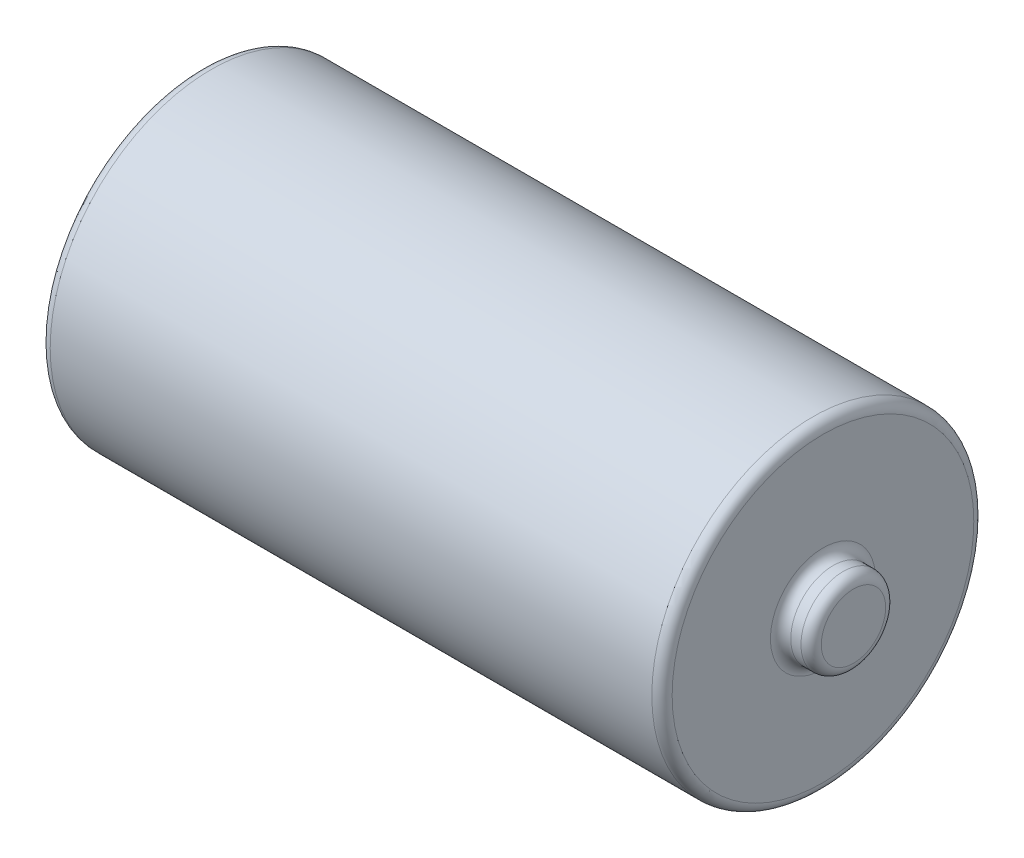
ISO-10303-21;
HEADER;
FILE_DESCRIPTION(('STEP AP214'),'2;1');
FILE_NAME('part.step','',(''),(''),'','','');
FILE_SCHEMA(('AUTOMOTIVE_DESIGN { 1 0 10303 214 1 1 1 1 }'));
ENDSEC;
DATA;
#1=APPLICATION_CONTEXT('core data for automotive mechanical design processes');
#2=APPLICATION_PROTOCOL_DEFINITION('international standard','automotive_design',2000,#1);
#3=PRODUCT_CONTEXT('',#1,'mechanical');
#4=PRODUCT('Part','Part','',(#3));
#5=PRODUCT_RELATED_PRODUCT_CATEGORY('part','',(#4));
#6=PRODUCT_DEFINITION_FORMATION('','',#4);
#7=PRODUCT_DEFINITION_CONTEXT('part definition',#1,'design');
#8=PRODUCT_DEFINITION('design','',#6,#7);
#9=PRODUCT_DEFINITION_SHAPE('','',#8);
#10=(LENGTH_UNIT() NAMED_UNIT(*) SI_UNIT(.MILLI.,.METRE.));
#11=(NAMED_UNIT(*) PLANE_ANGLE_UNIT() SI_UNIT($,.RADIAN.));
#12=(NAMED_UNIT(*) SI_UNIT($,.STERADIAN.) SOLID_ANGLE_UNIT());
#13=UNCERTAINTY_MEASURE_WITH_UNIT(LENGTH_MEASURE(1.E-05),#10,'distance_accuracy_value','');
#14=(GEOMETRIC_REPRESENTATION_CONTEXT(3) GLOBAL_UNCERTAINTY_ASSIGNED_CONTEXT((#13)) GLOBAL_UNIT_ASSIGNED_CONTEXT((#10,
#11,#12)) REPRESENTATION_CONTEXT('',''));
#15=CARTESIAN_POINT('',(0.,0.,0.));
#16=DIRECTION('',(0.,0.,1.));
#17=DIRECTION('',(1.,0.,0.));
#18=AXIS2_PLACEMENT_3D('',#15,#16,#17);
#19=CARTESIAN_POINT('',(23.3045,0.,0.));
#20=DIRECTION('',(-1.,0.,0.));
#21=DIRECTION('',(0.,0.,1.));
#22=AXIS2_PLACEMENT_3D('',#19,#20,#21);
#23=CYLINDRICAL_SURFACE('',#22,12.065);
#24=CARTESIAN_POINT('',(22.5425,0.,0.));
#25=DIRECTION('',(1.,0.,0.));
#26=DIRECTION('',(0.,0.,-1.));
#27=AXIS2_PLACEMENT_3D('',#24,#25,#26);
#28=CIRCLE('',#27,12.065);
#29=CARTESIAN_POINT('',(22.5425,0.,-12.065));
#30=VERTEX_POINT('',#29);
#31=EDGE_CURVE('E40',#30,#30,#28,.F.);
#32=ORIENTED_EDGE('',*,*,#31,.T.);
#33=EDGE_LOOP('',(#32));
#34=FACE_BOUND('',#33,.T.);
#35=CARTESIAN_POINT('',(-22.5425,0.,0.));
#36=DIRECTION('',(1.,0.,0.));
#37=DIRECTION('',(0.,0.,-1.));
#38=AXIS2_PLACEMENT_3D('',#35,#36,#37);
#39=CIRCLE('',#38,12.065);
#40=CARTESIAN_POINT('',(-22.5425,0.,-12.065));
#41=VERTEX_POINT('',#40);
#42=EDGE_CURVE('E44',#41,#41,#39,.T.);
#43=ORIENTED_EDGE('',*,*,#42,.T.);
#44=EDGE_LOOP('',(#43));
#45=FACE_BOUND('',#44,.T.);
#46=ADVANCED_FACE('F33',(#34,#45),#23,.T.);
#47=CARTESIAN_POINT('',(23.3045,0.,0.));
#48=DIRECTION('',(1.,0.,0.));
#49=DIRECTION('',(0.,0.,-1.));
#50=AXIS2_PLACEMENT_3D('',#47,#48,#49);
#51=PLANE('',#50);
#52=CARTESIAN_POINT('',(23.3045,0.,0.));
#53=DIRECTION('',(1.,0.,0.));
#54=DIRECTION('',(0.,0.,-1.));
#55=AXIS2_PLACEMENT_3D('',#52,#53,#54);
#56=CIRCLE('',#55,11.303);
#57=CARTESIAN_POINT('',(23.3045,0.,-11.303));
#58=VERTEX_POINT('',#57);
#59=EDGE_CURVE('E48',#58,#58,#56,.T.);
#60=ORIENTED_EDGE('',*,*,#59,.T.);
#61=EDGE_LOOP('',(#60));
#62=FACE_BOUND('',#61,.T.);
#63=CARTESIAN_POINT('',(23.3045,0.,0.));
#64=DIRECTION('',(1.,0.,0.));
#65=DIRECTION('',(0.,0.,-1.));
#66=AXIS2_PLACEMENT_3D('',#63,#64,#65);
#67=CIRCLE('',#66,3.937);
#68=CARTESIAN_POINT('',(23.3045,0.,-3.937));
#69=VERTEX_POINT('',#68);
#70=EDGE_CURVE('E53',#69,#69,#67,.F.);
#71=ORIENTED_EDGE('',*,*,#70,.T.);
#72=EDGE_LOOP('',(#71));
#73=FACE_BOUND('',#72,.T.);
#74=ADVANCED_FACE('F85',(#62,#73),#51,.T.);
#75=CARTESIAN_POINT('',(-23.3045,0.,0.));
#76=DIRECTION('',(1.,0.,0.));
#77=DIRECTION('',(0.,0.,-1.));
#78=AXIS2_PLACEMENT_3D('',#75,#76,#77);
#79=PLANE('',#78);
#80=CARTESIAN_POINT('',(-23.3045,0.,0.));
#81=DIRECTION('',(1.,0.,0.));
#82=DIRECTION('',(0.,0.,-1.));
#83=AXIS2_PLACEMENT_3D('',#80,#81,#82);
#84=CIRCLE('',#83,11.303);
#85=CARTESIAN_POINT('',(-23.3045,0.,-11.303));
#86=VERTEX_POINT('',#85);
#87=EDGE_CURVE('E10',#86,#86,#84,.F.);
#88=ORIENTED_EDGE('',*,*,#87,.T.);
#89=EDGE_LOOP('',(#88));
#90=FACE_BOUND('',#89,.T.);
#91=ADVANCED_FACE('F89',(#90),#79,.F.);
#92=CARTESIAN_POINT('',(23.3045,0.,0.));
#93=DIRECTION('',(1.,0.,0.));
#94=DIRECTION('',(0.,0.,-1.));
#95=AXIS2_PLACEMENT_3D('',#92,#93,#94);
#96=CYLINDRICAL_SURFACE('',#95,3.175);
#97=CARTESIAN_POINT('',(24.8285,0.,0.));
#98=DIRECTION('',(1.,0.,0.));
#99=DIRECTION('',(0.,0.,-1.));
#100=AXIS2_PLACEMENT_3D('',#97,#98,#99);
#101=CIRCLE('',#100,3.175);
#102=CARTESIAN_POINT('',(24.8285,0.,-3.175));
#103=VERTEX_POINT('',#102);
#104=EDGE_CURVE('E56',#103,#103,#101,.F.);
#105=ORIENTED_EDGE('',*,*,#104,.T.);
#106=EDGE_LOOP('',(#105));
#107=FACE_BOUND('',#106,.T.);
#108=CARTESIAN_POINT('',(24.0665,0.,0.));
#109=DIRECTION('',(1.,0.,0.));
#110=DIRECTION('',(0.,0.,-1.));
#111=AXIS2_PLACEMENT_3D('',#108,#109,#110);
#112=CIRCLE('',#111,3.175);
#113=CARTESIAN_POINT('',(24.0665,0.,-3.175));
#114=VERTEX_POINT('',#113);
#115=EDGE_CURVE('E59',#114,#114,#112,.T.);
#116=ORIENTED_EDGE('',*,*,#115,.T.);
#117=EDGE_LOOP('',(#116));
#118=FACE_BOUND('',#117,.T.);
#119=ADVANCED_FACE('F80',(#107,#118),#96,.T.);
#120=CARTESIAN_POINT('',(25.5905,0.,0.));
#121=DIRECTION('',(1.,0.,0.));
#122=DIRECTION('',(0.,0.,-1.));
#123=AXIS2_PLACEMENT_3D('',#120,#121,#122);
#124=PLANE('',#123);
#125=CARTESIAN_POINT('',(25.5905,0.,0.));
#126=DIRECTION('',(1.,0.,0.));
#127=DIRECTION('',(0.,0.,-1.));
#128=AXIS2_PLACEMENT_3D('',#125,#126,#127);
#129=CIRCLE('',#128,2.413);
#130=CARTESIAN_POINT('',(25.5905,0.,-2.413));
#131=VERTEX_POINT('',#130);
#132=EDGE_CURVE('E62',#131,#131,#129,.T.);
#133=ORIENTED_EDGE('',*,*,#132,.T.);
#134=EDGE_LOOP('',(#133));
#135=FACE_BOUND('',#134,.T.);
#136=ADVANCED_FACE('F66',(#135),#124,.T.);
#137=CARTESIAN_POINT('',(24.8285,0.,0.));
#138=DIRECTION('',(1.,0.,0.));
#139=DIRECTION('',(0.,0.,-1.));
#140=AXIS2_PLACEMENT_3D('',#137,#138,#139);
#141=TOROIDAL_SURFACE('',#140,2.413,0.762);
#142=ORIENTED_EDGE('',*,*,#104,.F.);
#143=EDGE_LOOP('',(#142));
#144=FACE_BOUND('',#143,.T.);
#145=ORIENTED_EDGE('',*,*,#132,.F.);
#146=EDGE_LOOP('',(#145));
#147=FACE_BOUND('',#146,.T.);
#148=ADVANCED_FACE('F68',(#144,#147),#141,.T.);
#149=CARTESIAN_POINT('',(24.0665,0.,0.));
#150=DIRECTION('',(1.,0.,0.));
#151=DIRECTION('',(0.,0.,-1.));
#152=AXIS2_PLACEMENT_3D('',#149,#150,#151);
#153=TOROIDAL_SURFACE('',#152,3.937,0.762);
#154=ORIENTED_EDGE('',*,*,#70,.F.);
#155=EDGE_LOOP('',(#154));
#156=FACE_BOUND('',#155,.T.);
#157=ORIENTED_EDGE('',*,*,#115,.F.);
#158=EDGE_LOOP('',(#157));
#159=FACE_BOUND('',#158,.T.);
#160=ADVANCED_FACE('F70',(#156,#159),#153,.F.);
#161=CARTESIAN_POINT('',(22.5425,0.,0.));
#162=DIRECTION('',(1.,0.,0.));
#163=DIRECTION('',(0.,0.,-1.));
#164=AXIS2_PLACEMENT_3D('',#161,#162,#163);
#165=TOROIDAL_SURFACE('',#164,11.303,0.762);
#166=ORIENTED_EDGE('',*,*,#31,.F.);
#167=EDGE_LOOP('',(#166));
#168=FACE_BOUND('',#167,.T.);
#169=ORIENTED_EDGE('',*,*,#59,.F.);
#170=EDGE_LOOP('',(#169));
#171=FACE_BOUND('',#170,.T.);
#172=ADVANCED_FACE('F77',(#168,#171),#165,.T.);
#173=CARTESIAN_POINT('',(-22.5425,0.,0.));
#174=DIRECTION('',(1.,0.,0.));
#175=DIRECTION('',(0.,0.,-1.));
#176=AXIS2_PLACEMENT_3D('',#173,#174,#175);
#177=TOROIDAL_SURFACE('',#176,11.303,0.762);
#178=ORIENTED_EDGE('',*,*,#87,.F.);
#179=EDGE_LOOP('',(#178));
#180=FACE_BOUND('',#179,.T.);
#181=ORIENTED_EDGE('',*,*,#42,.F.);
#182=EDGE_LOOP('',(#181));
#183=FACE_BOUND('',#182,.T.);
#184=ADVANCED_FACE('F35',(#180,#183),#177,.T.);
#185=CLOSED_SHELL('',(#46,#74,#91,#119,#136,#148,#160,#172,#184));
#186=MANIFOLD_SOLID_BREP('B2',#185);
#187=ADVANCED_BREP_SHAPE_REPRESENTATION('',(#18,#186),#14);
#188=SHAPE_DEFINITION_REPRESENTATION(#9,#187);
ENDSEC;
END-ISO-10303-21;
